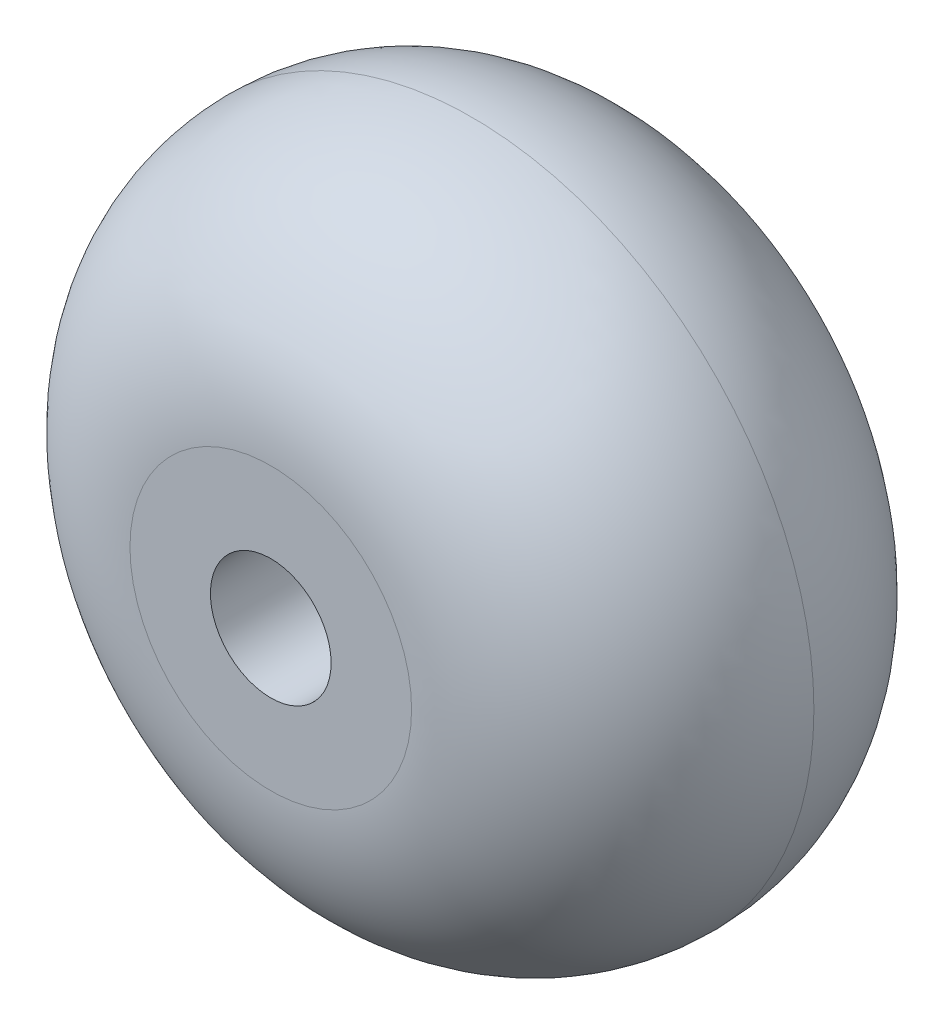
ISO-10303-21;
HEADER;
FILE_DESCRIPTION(('STEP AP214'),'2;1');
FILE_NAME('part.step','',(''),(''),'','','');
FILE_SCHEMA(('AUTOMOTIVE_DESIGN { 1 0 10303 214 1 1 1 1 }'));
ENDSEC;
DATA;
#1=APPLICATION_CONTEXT('core data for automotive mechanical design processes');
#2=APPLICATION_PROTOCOL_DEFINITION('international standard','automotive_design',2000,#1);
#3=PRODUCT_CONTEXT('',#1,'mechanical');
#4=PRODUCT('Part','Part','',(#3));
#5=PRODUCT_RELATED_PRODUCT_CATEGORY('part','',(#4));
#6=PRODUCT_DEFINITION_FORMATION('','',#4);
#7=PRODUCT_DEFINITION_CONTEXT('part definition',#1,'design');
#8=PRODUCT_DEFINITION('design','',#6,#7);
#9=PRODUCT_DEFINITION_SHAPE('','',#8);
#10=(LENGTH_UNIT() NAMED_UNIT(*) SI_UNIT(.MILLI.,.METRE.));
#11=(NAMED_UNIT(*) PLANE_ANGLE_UNIT() SI_UNIT($,.RADIAN.));
#12=(NAMED_UNIT(*) SI_UNIT($,.STERADIAN.) SOLID_ANGLE_UNIT());
#13=UNCERTAINTY_MEASURE_WITH_UNIT(LENGTH_MEASURE(1.E-05),#10,'distance_accuracy_value','');
#14=(GEOMETRIC_REPRESENTATION_CONTEXT(3) GLOBAL_UNCERTAINTY_ASSIGNED_CONTEXT((#13)) GLOBAL_UNIT_ASSIGNED_CONTEXT((#10,
#11,#12)) REPRESENTATION_CONTEXT('',''));
#15=CARTESIAN_POINT('',(0.,0.,0.));
#16=DIRECTION('',(0.,0.,1.));
#17=DIRECTION('',(1.,0.,0.));
#18=AXIS2_PLACEMENT_3D('',#15,#16,#17);
#19=CARTESIAN_POINT('',(0.,0.,20.));
#20=DIRECTION('',(0.,0.,1.));
#21=DIRECTION('',(1.,0.,0.));
#22=AXIS2_PLACEMENT_3D('',#19,#20,#21);
#23=PLANE('',#22);
#24=CARTESIAN_POINT('',(0.,0.,20.));
#25=DIRECTION('',(0.,0.,1.));
#26=DIRECTION('',(1.,0.,0.));
#27=AXIS2_PLACEMENT_3D('',#24,#25,#26);
#28=CIRCLE('',#27,7.);
#29=CARTESIAN_POINT('',(7.,0.,20.));
#30=VERTEX_POINT('',#29);
#31=EDGE_CURVE('E10',#30,#30,#28,.T.);
#32=ORIENTED_EDGE('',*,*,#31,.T.);
#33=EDGE_LOOP('',(#32));
#34=FACE_BOUND('',#33,.T.);
#35=CARTESIAN_POINT('',(0.,0.,20.));
#36=DIRECTION('',(0.,0.,1.));
#37=DIRECTION('',(1.,0.,0.));
#38=AXIS2_PLACEMENT_3D('',#35,#36,#37);
#39=CIRCLE('',#38,3.);
#40=CARTESIAN_POINT('',(3.,0.,20.));
#41=VERTEX_POINT('',#40);
#42=EDGE_CURVE('E42',#41,#41,#39,.T.);
#43=ORIENTED_EDGE('',*,*,#42,.F.);
#44=EDGE_LOOP('',(#43));
#45=FACE_BOUND('',#44,.T.);
#46=ADVANCED_FACE('F30',(#34,#45),#23,.T.);
#47=CARTESIAN_POINT('',(0.,0.,0.));
#48=DIRECTION('',(0.,0.,1.));
#49=DIRECTION('',(1.,0.,0.));
#50=AXIS2_PLACEMENT_3D('',#47,#48,#49);
#51=PLANE('',#50);
#52=CARTESIAN_POINT('',(0.,0.,0.));
#53=DIRECTION('',(0.,0.,1.));
#54=DIRECTION('',(1.,0.,0.));
#55=AXIS2_PLACEMENT_3D('',#52,#53,#54);
#56=CIRCLE('',#55,7.);
#57=CARTESIAN_POINT('',(7.,0.,0.));
#58=VERTEX_POINT('',#57);
#59=EDGE_CURVE('E38',#58,#58,#56,.F.);
#60=ORIENTED_EDGE('',*,*,#59,.T.);
#61=EDGE_LOOP('',(#60));
#62=FACE_BOUND('',#61,.T.);
#63=CARTESIAN_POINT('',(0.,0.,0.));
#64=DIRECTION('',(0.,0.,1.));
#65=DIRECTION('',(1.,0.,0.));
#66=AXIS2_PLACEMENT_3D('',#63,#64,#65);
#67=CIRCLE('',#66,3.);
#68=CARTESIAN_POINT('',(3.,0.,0.));
#69=VERTEX_POINT('',#68);
#70=EDGE_CURVE('E45',#69,#69,#67,.T.);
#71=ORIENTED_EDGE('',*,*,#70,.T.);
#72=EDGE_LOOP('',(#71));
#73=FACE_BOUND('',#72,.T.);
#74=ADVANCED_FACE('F55',(#62,#73),#51,.F.);
#75=CARTESIAN_POINT('',(0.,0.,20.));
#76=DIRECTION('',(0.,0.,-1.));
#77=DIRECTION('',(-1.,0.,0.));
#78=AXIS2_PLACEMENT_3D('',#75,#76,#77);
#79=CYLINDRICAL_SURFACE('',#78,3.);
#80=ORIENTED_EDGE('',*,*,#42,.T.);
#81=EDGE_LOOP('',(#80));
#82=FACE_BOUND('',#81,.T.);
#83=ORIENTED_EDGE('',*,*,#70,.F.);
#84=EDGE_LOOP('',(#83));
#85=FACE_BOUND('',#84,.T.);
#86=ADVANCED_FACE('F51',(#82,#85),#79,.F.);
#87=CARTESIAN_POINT('',(0.,0.,10.));
#88=DIRECTION('',(0.,0.,1.));
#89=DIRECTION('',(1.,0.,0.));
#90=AXIS2_PLACEMENT_3D('',#87,#88,#89);
#91=DEGENERATE_TOROIDAL_SURFACE('',#90,7.,10.,.T.);
#92=ORIENTED_EDGE('',*,*,#31,.F.);
#93=EDGE_LOOP('',(#92));
#94=FACE_BOUND('',#93,.T.);
#95=CARTESIAN_POINT('',(0.,0.,10.));
#96=DIRECTION('',(0.,0.,1.));
#97=DIRECTION('',(1.,0.,0.));
#98=AXIS2_PLACEMENT_3D('',#95,#96,#97);
#99=CIRCLE('',#98,17.);
#100=CARTESIAN_POINT('',(17.,0.,10.));
#101=VERTEX_POINT('',#100);
#102=EDGE_CURVE('E34',#101,#101,#99,.F.);
#103=ORIENTED_EDGE('',*,*,#102,.F.);
#104=EDGE_LOOP('',(#103));
#105=FACE_BOUND('',#104,.T.);
#106=ADVANCED_FACE('F32',(#94,#105),#91,.T.);
#107=CARTESIAN_POINT('',(0.,0.,10.));
#108=DIRECTION('',(0.,0.,1.));
#109=DIRECTION('',(1.,0.,0.));
#110=AXIS2_PLACEMENT_3D('',#107,#108,#109);
#111=DEGENERATE_TOROIDAL_SURFACE('',#110,7.,10.,.T.);
#112=ORIENTED_EDGE('',*,*,#59,.F.);
#113=EDGE_LOOP('',(#112));
#114=FACE_BOUND('',#113,.T.);
#115=ORIENTED_EDGE('',*,*,#102,.T.);
#116=EDGE_LOOP('',(#115));
#117=FACE_BOUND('',#116,.T.);
#118=ADVANCED_FACE('F63',(#114,#117),#111,.T.);
#119=CLOSED_SHELL('',(#46,#74,#86,#106,#118));
#120=MANIFOLD_SOLID_BREP('B2',#119);
#121=ADVANCED_BREP_SHAPE_REPRESENTATION('',(#18,#120),#14);
#122=SHAPE_DEFINITION_REPRESENTATION(#9,#121);
ENDSEC;
END-ISO-10303-21;
